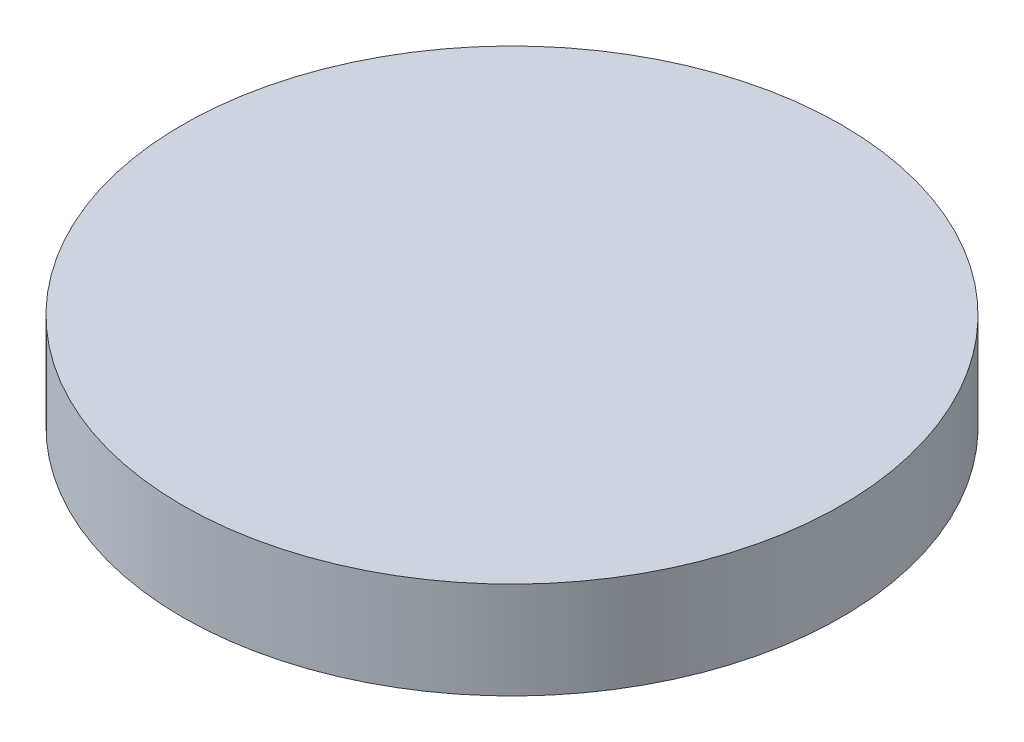
ISO-10303-21;
HEADER;
FILE_DESCRIPTION(('STEP AP214'),'2;1');
FILE_NAME('part.step','',(''),(''),'','','');
FILE_SCHEMA(('AUTOMOTIVE_DESIGN { 1 0 10303 214 1 1 1 1 }'));
ENDSEC;
DATA;
#1=APPLICATION_CONTEXT('core data for automotive mechanical design processes');
#2=APPLICATION_PROTOCOL_DEFINITION('international standard','automotive_design',2000,#1);
#3=PRODUCT_CONTEXT('',#1,'mechanical');
#4=PRODUCT('Part','Part','',(#3));
#5=PRODUCT_RELATED_PRODUCT_CATEGORY('part','',(#4));
#6=PRODUCT_DEFINITION_FORMATION('','',#4);
#7=PRODUCT_DEFINITION_CONTEXT('part definition',#1,'design');
#8=PRODUCT_DEFINITION('design','',#6,#7);
#9=PRODUCT_DEFINITION_SHAPE('','',#8);
#10=(LENGTH_UNIT() NAMED_UNIT(*) SI_UNIT(.MILLI.,.METRE.));
#11=(NAMED_UNIT(*) PLANE_ANGLE_UNIT() SI_UNIT($,.RADIAN.));
#12=(NAMED_UNIT(*) SI_UNIT($,.STERADIAN.) SOLID_ANGLE_UNIT());
#13=UNCERTAINTY_MEASURE_WITH_UNIT(LENGTH_MEASURE(1.E-05),#10,'distance_accuracy_value','');
#14=(GEOMETRIC_REPRESENTATION_CONTEXT(3) GLOBAL_UNCERTAINTY_ASSIGNED_CONTEXT((#13)) GLOBAL_UNIT_ASSIGNED_CONTEXT((#10,
#11,#12)) REPRESENTATION_CONTEXT('',''));
#15=CARTESIAN_POINT('',(0.,0.,0.));
#16=DIRECTION('',(0.,0.,1.));
#17=DIRECTION('',(1.,0.,0.));
#18=AXIS2_PLACEMENT_3D('',#15,#16,#17);
#19=CARTESIAN_POINT('',(-21.4426109653147,24.,0.));
#20=DIRECTION('',(0.,-1.,0.));
#21=DIRECTION('',(0.,0.,-1.));
#22=AXIS2_PLACEMENT_3D('',#19,#20,#21);
#23=CYLINDRICAL_SURFACE('',#22,81.644262660002);
#24=CARTESIAN_POINT('',(-21.4426109653147,24.,0.));
#25=DIRECTION('',(0.,1.,0.));
#26=DIRECTION('',(0.,0.,1.));
#27=AXIS2_PLACEMENT_3D('',#24,#25,#26);
#28=CIRCLE('',#27,81.644262660002);
#29=CARTESIAN_POINT('',(-21.4426109653147,24.,81.644262660002));
#30=VERTEX_POINT('',#29);
#31=EDGE_CURVE('E10',#30,#30,#28,.T.);
#32=ORIENTED_EDGE('',*,*,#31,.F.);
#33=EDGE_LOOP('',(#32));
#34=FACE_BOUND('',#33,.T.);
#35=CARTESIAN_POINT('',(-21.4426109653147,0.,0.));
#36=DIRECTION('',(0.,1.,0.));
#37=DIRECTION('',(0.,0.,1.));
#38=AXIS2_PLACEMENT_3D('',#35,#36,#37);
#39=CIRCLE('',#38,81.644262660002);
#40=CARTESIAN_POINT('',(-21.4426109653147,0.,81.644262660002));
#41=VERTEX_POINT('',#40);
#42=EDGE_CURVE('E34',#41,#41,#39,.T.);
#43=ORIENTED_EDGE('',*,*,#42,.T.);
#44=EDGE_LOOP('',(#43));
#45=FACE_BOUND('',#44,.T.);
#46=ADVANCED_FACE('F31',(#34,#45),#23,.T.);
#47=CARTESIAN_POINT('',(-21.4426109653147,24.,0.));
#48=DIRECTION('',(0.,1.,0.));
#49=DIRECTION('',(0.,0.,1.));
#50=AXIS2_PLACEMENT_3D('',#47,#48,#49);
#51=PLANE('',#50);
#52=ORIENTED_EDGE('',*,*,#31,.T.);
#53=EDGE_LOOP('',(#52));
#54=FACE_BOUND('',#53,.T.);
#55=ADVANCED_FACE('F46',(#54),#51,.T.);
#56=CARTESIAN_POINT('',(-21.4426109653147,0.,0.));
#57=DIRECTION('',(0.,1.,0.));
#58=DIRECTION('',(0.,0.,1.));
#59=AXIS2_PLACEMENT_3D('',#56,#57,#58);
#60=PLANE('',#59);
#61=ORIENTED_EDGE('',*,*,#42,.F.);
#62=EDGE_LOOP('',(#61));
#63=FACE_BOUND('',#62,.T.);
#64=ADVANCED_FACE('F44',(#63),#60,.F.);
#65=CLOSED_SHELL('',(#46,#55,#64));
#66=MANIFOLD_SOLID_BREP('B2',#65);
#67=ADVANCED_BREP_SHAPE_REPRESENTATION('',(#18,#66),#14);
#68=SHAPE_DEFINITION_REPRESENTATION(#9,#67);
ENDSEC;
END-ISO-10303-21;
